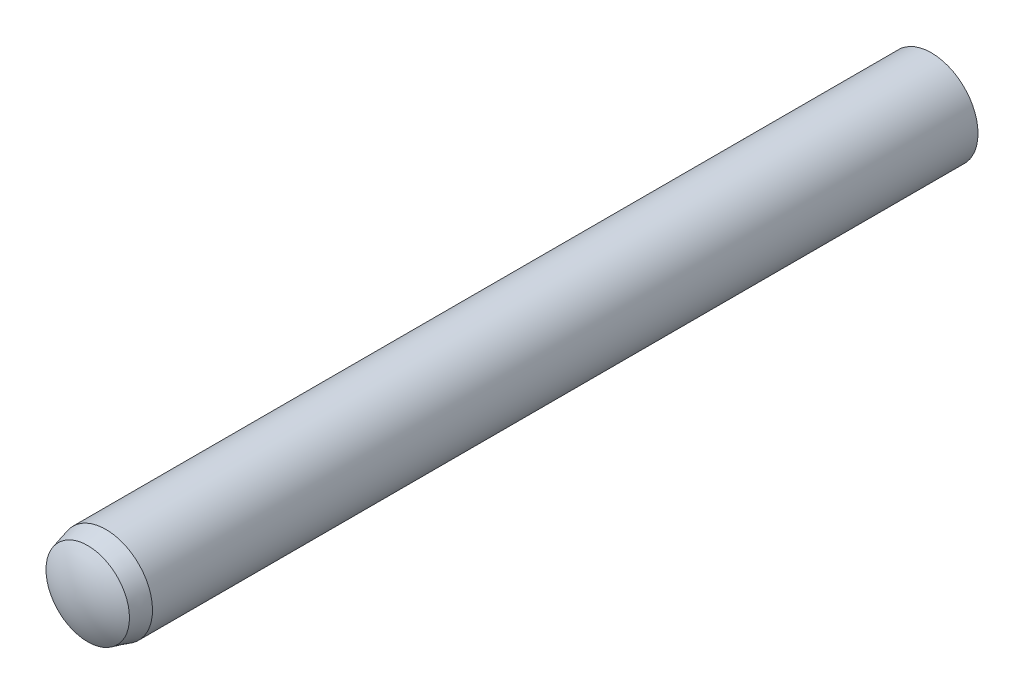
ISO-10303-21;
HEADER;
FILE_DESCRIPTION(('STEP AP214'),'2;1');
FILE_NAME('part.step','',(''),(''),'','','');
FILE_SCHEMA(('AUTOMOTIVE_DESIGN { 1 0 10303 214 1 1 1 1 }'));
ENDSEC;
DATA;
#1=APPLICATION_CONTEXT('core data for automotive mechanical design processes');
#2=APPLICATION_PROTOCOL_DEFINITION('international standard','automotive_design',2000,#1);
#3=PRODUCT_CONTEXT('',#1,'mechanical');
#4=PRODUCT('Part','Part','',(#3));
#5=PRODUCT_RELATED_PRODUCT_CATEGORY('part','',(#4));
#6=PRODUCT_DEFINITION_FORMATION('','',#4);
#7=PRODUCT_DEFINITION_CONTEXT('part definition',#1,'design');
#8=PRODUCT_DEFINITION('design','',#6,#7);
#9=PRODUCT_DEFINITION_SHAPE('','',#8);
#10=(LENGTH_UNIT() NAMED_UNIT(*) SI_UNIT(.MILLI.,.METRE.));
#11=(NAMED_UNIT(*) PLANE_ANGLE_UNIT() SI_UNIT($,.RADIAN.));
#12=(NAMED_UNIT(*) SI_UNIT($,.STERADIAN.) SOLID_ANGLE_UNIT());
#13=UNCERTAINTY_MEASURE_WITH_UNIT(LENGTH_MEASURE(1.E-05),#10,'distance_accuracy_value','');
#14=(GEOMETRIC_REPRESENTATION_CONTEXT(3) GLOBAL_UNCERTAINTY_ASSIGNED_CONTEXT((#13)) GLOBAL_UNIT_ASSIGNED_CONTEXT((#10,
#11,#12)) REPRESENTATION_CONTEXT('',''));
#15=CARTESIAN_POINT('',(0.,0.,0.));
#16=DIRECTION('',(0.,0.,1.));
#17=DIRECTION('',(1.,0.,0.));
#18=AXIS2_PLACEMENT_3D('',#15,#16,#17);
#19=CARTESIAN_POINT('',(0.,0.,-11.275));
#20=DIRECTION('',(0.,0.,1.));
#21=DIRECTION('',(0.,1.,0.));
#22=AXIS2_PLACEMENT_3D('',#19,#20,#21);
#23=SPHERICAL_SURFACE('',#22,2.72500000000001);
#24=CARTESIAN_POINT('',(0.,0.,-13.55));
#25=DIRECTION('',(0.,0.,1.));
#26=DIRECTION('',(0.,-1.,0.));
#27=AXIS2_PLACEMENT_3D('',#24,#25,#26);
#28=CIRCLE('',#27,1.5);
#29=CARTESIAN_POINT('',(0.,-1.49999999999999,-13.55));
#30=VERTEX_POINT('',#29);
#31=EDGE_CURVE('E10',#30,#30,#28,.T.);
#32=ORIENTED_EDGE('',*,*,#31,.F.);
#33=EDGE_LOOP('',(#32));
#34=FACE_BOUND('',#33,.T.);
#35=ADVANCED_FACE('F32',(#34),#23,.T.);
#36=CARTESIAN_POINT('',(0.,0.,14.));
#37=DIRECTION('',(0.,0.,1.));
#38=DIRECTION('',(0.,-1.,0.));
#39=AXIS2_PLACEMENT_3D('',#36,#37,#38);
#40=CYLINDRICAL_SURFACE('',#39,1.5);
#41=CARTESIAN_POINT('',(0.,0.,13.025));
#42=DIRECTION('',(0.,0.,1.));
#43=DIRECTION('',(0.,-1.,0.));
#44=AXIS2_PLACEMENT_3D('',#41,#42,#43);
#45=CIRCLE('',#44,1.5);
#46=CARTESIAN_POINT('',(0.,-1.5,13.025));
#47=VERTEX_POINT('',#46);
#48=EDGE_CURVE('E38',#47,#47,#45,.T.);
#49=ORIENTED_EDGE('',*,*,#48,.F.);
#50=EDGE_LOOP('',(#49));
#51=FACE_BOUND('',#50,.T.);
#52=ORIENTED_EDGE('',*,*,#31,.T.);
#53=EDGE_LOOP('',(#52));
#54=FACE_BOUND('',#53,.T.);
#55=ADVANCED_FACE('F53',(#51,#54),#40,.T.);
#56=CARTESIAN_POINT('',(0.,0.,13.025));
#57=DIRECTION('',(0.,0.,-1.));
#58=DIRECTION('',(0.,1.,0.));
#59=AXIS2_PLACEMENT_3D('',#56,#57,#58);
#60=CONICAL_SURFACE('',#59,1.5,0.261799387799152);
#61=CARTESIAN_POINT('',(0.,0.,13.61));
#62=DIRECTION('',(0.,0.,1.));
#63=DIRECTION('',(0.,-1.,0.));
#64=AXIS2_PLACEMENT_3D('',#61,#62,#63);
#65=CIRCLE('',#64,1.34324972242779);
#66=CARTESIAN_POINT('',(0.,-1.34324972242779,13.61));
#67=VERTEX_POINT('',#66);
#68=EDGE_CURVE('E42',#67,#67,#65,.T.);
#69=ORIENTED_EDGE('',*,*,#68,.F.);
#70=EDGE_LOOP('',(#69));
#71=FACE_BOUND('',#70,.T.);
#72=ORIENTED_EDGE('',*,*,#48,.T.);
#73=EDGE_LOOP('',(#72));
#74=FACE_BOUND('',#73,.T.);
#75=ADVANCED_FACE('F51',(#71,#74),#60,.T.);
#76=CARTESIAN_POINT('',(0.,0.,11.491769465638));
#77=DIRECTION('',(0.,0.,1.));
#78=DIRECTION('',(0.,1.,0.));
#79=AXIS2_PLACEMENT_3D('',#76,#77,#78);
#80=SPHERICAL_SURFACE('',#79,2.50823053436198);
#81=ORIENTED_EDGE('',*,*,#68,.T.);
#82=EDGE_LOOP('',(#81));
#83=FACE_BOUND('',#82,.T.);
#84=ADVANCED_FACE('F49',(#83),#80,.T.);
#85=CLOSED_SHELL('',(#35,#55,#75,#84));
#86=MANIFOLD_SOLID_BREP('B2',#85);
#87=ADVANCED_BREP_SHAPE_REPRESENTATION('',(#18,#86),#14);
#88=SHAPE_DEFINITION_REPRESENTATION(#9,#87);
ENDSEC;
END-ISO-10303-21;
